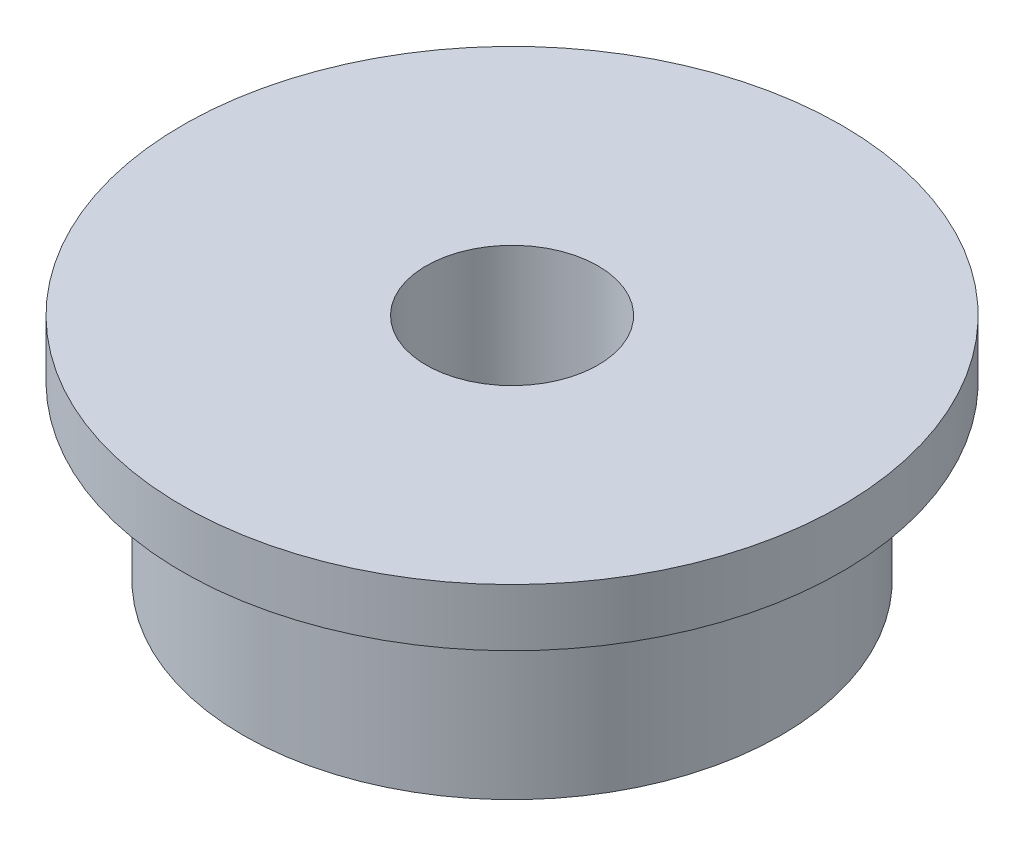
ISO-10303-21;
HEADER;
FILE_DESCRIPTION(('STEP AP214'),'2;1');
FILE_NAME('part.step','',(''),(''),'','','');
FILE_SCHEMA(('AUTOMOTIVE_DESIGN { 1 0 10303 214 1 1 1 1 }'));
ENDSEC;
DATA;
#1=APPLICATION_CONTEXT('core data for automotive mechanical design processes');
#2=APPLICATION_PROTOCOL_DEFINITION('international standard','automotive_design',2000,#1);
#3=PRODUCT_CONTEXT('',#1,'mechanical');
#4=PRODUCT('Part','Part','',(#3));
#5=PRODUCT_RELATED_PRODUCT_CATEGORY('part','',(#4));
#6=PRODUCT_DEFINITION_FORMATION('','',#4);
#7=PRODUCT_DEFINITION_CONTEXT('part definition',#1,'design');
#8=PRODUCT_DEFINITION('design','',#6,#7);
#9=PRODUCT_DEFINITION_SHAPE('','',#8);
#10=(LENGTH_UNIT() NAMED_UNIT(*) SI_UNIT(.MILLI.,.METRE.));
#11=(NAMED_UNIT(*) PLANE_ANGLE_UNIT() SI_UNIT($,.RADIAN.));
#12=(NAMED_UNIT(*) SI_UNIT($,.STERADIAN.) SOLID_ANGLE_UNIT());
#13=UNCERTAINTY_MEASURE_WITH_UNIT(LENGTH_MEASURE(1.E-05),#10,'distance_accuracy_value','');
#14=(GEOMETRIC_REPRESENTATION_CONTEXT(3) GLOBAL_UNCERTAINTY_ASSIGNED_CONTEXT((#13)) GLOBAL_UNIT_ASSIGNED_CONTEXT((#10,
#11,#12)) REPRESENTATION_CONTEXT('',''));
#15=CARTESIAN_POINT('',(0.,0.,0.));
#16=DIRECTION('',(0.,0.,1.));
#17=DIRECTION('',(1.,0.,0.));
#18=AXIS2_PLACEMENT_3D('',#15,#16,#17);
#19=CARTESIAN_POINT('',(-4.69,0.543442622950821,0.));
#20=DIRECTION('',(0.,1.,0.));
#21=DIRECTION('',(0.,0.,1.));
#22=AXIS2_PLACEMENT_3D('',#19,#20,#21);
#23=PLANE('',#22);
#24=CARTESIAN_POINT('',(0.,0.543442622950821,0.));
#25=DIRECTION('',(0.,-1.,0.));
#26=DIRECTION('',(0.,0.,-1.));
#27=AXIS2_PLACEMENT_3D('',#24,#25,#26);
#28=CIRCLE('',#27,1.5);
#29=CARTESIAN_POINT('',(0.,0.543442622950821,-1.5));
#30=VERTEX_POINT('',#29);
#31=EDGE_CURVE('E10',#30,#30,#28,.T.);
#32=ORIENTED_EDGE('',*,*,#31,.F.);
#33=EDGE_LOOP('',(#32));
#34=FACE_BOUND('',#33,.T.);
#35=CARTESIAN_POINT('',(0.,0.543442622950821,0.));
#36=DIRECTION('',(0.,-1.,0.));
#37=DIRECTION('',(0.,0.,-1.));
#38=AXIS2_PLACEMENT_3D('',#35,#36,#37);
#39=CIRCLE('',#38,4.69);
#40=CARTESIAN_POINT('',(0.,0.543442622950821,-4.69));
#41=VERTEX_POINT('',#40);
#42=EDGE_CURVE('E54',#41,#41,#39,.T.);
#43=ORIENTED_EDGE('',*,*,#42,.T.);
#44=EDGE_LOOP('',(#43));
#45=FACE_BOUND('',#44,.T.);
#46=ADVANCED_FACE('F32',(#34,#45),#23,.F.);
#47=CARTESIAN_POINT('',(0.,0.,0.));
#48=DIRECTION('',(0.,-1.,0.));
#49=DIRECTION('',(0.,0.,-1.));
#50=AXIS2_PLACEMENT_3D('',#47,#48,#49);
#51=CYLINDRICAL_SURFACE('',#50,1.5);
#52=CARTESIAN_POINT('',(0.,4.54344262295082,0.));
#53=DIRECTION('',(0.,-1.,0.));
#54=DIRECTION('',(0.,0.,-1.));
#55=AXIS2_PLACEMENT_3D('',#52,#53,#54);
#56=CIRCLE('',#55,1.5);
#57=CARTESIAN_POINT('',(0.,4.54344262295082,-1.5));
#58=VERTEX_POINT('',#57);
#59=EDGE_CURVE('E38',#58,#58,#56,.T.);
#60=ORIENTED_EDGE('',*,*,#59,.F.);
#61=EDGE_LOOP('',(#60));
#62=FACE_BOUND('',#61,.T.);
#63=ORIENTED_EDGE('',*,*,#31,.T.);
#64=EDGE_LOOP('',(#63));
#65=FACE_BOUND('',#64,.T.);
#66=ADVANCED_FACE('F79',(#62,#65),#51,.F.);
#67=CARTESIAN_POINT('',(-1.5,4.54344262295082,0.));
#68=DIRECTION('',(0.,-1.,0.));
#69=DIRECTION('',(0.,0.,-1.));
#70=AXIS2_PLACEMENT_3D('',#67,#68,#69);
#71=PLANE('',#70);
#72=CARTESIAN_POINT('',(0.,4.54344262295082,0.));
#73=DIRECTION('',(0.,-1.,0.));
#74=DIRECTION('',(0.,0.,-1.));
#75=AXIS2_PLACEMENT_3D('',#72,#73,#74);
#76=CIRCLE('',#75,5.75);
#77=CARTESIAN_POINT('',(0.,4.54344262295082,-5.75));
#78=VERTEX_POINT('',#77);
#79=EDGE_CURVE('E42',#78,#78,#76,.T.);
#80=ORIENTED_EDGE('',*,*,#79,.F.);
#81=EDGE_LOOP('',(#80));
#82=FACE_BOUND('',#81,.T.);
#83=ORIENTED_EDGE('',*,*,#59,.T.);
#84=EDGE_LOOP('',(#83));
#85=FACE_BOUND('',#84,.T.);
#86=ADVANCED_FACE('F74',(#82,#85),#71,.F.);
#87=CARTESIAN_POINT('',(0.,0.,0.));
#88=DIRECTION('',(0.,-1.,0.));
#89=DIRECTION('',(0.,0.,-1.));
#90=AXIS2_PLACEMENT_3D('',#87,#88,#89);
#91=CYLINDRICAL_SURFACE('',#90,5.75);
#92=CARTESIAN_POINT('',(0.,3.54344262295082,0.));
#93=DIRECTION('',(0.,-1.,0.));
#94=DIRECTION('',(0.,0.,-1.));
#95=AXIS2_PLACEMENT_3D('',#92,#93,#94);
#96=CIRCLE('',#95,5.75);
#97=CARTESIAN_POINT('',(0.,3.54344262295082,-5.75));
#98=VERTEX_POINT('',#97);
#99=EDGE_CURVE('E46',#98,#98,#96,.T.);
#100=ORIENTED_EDGE('',*,*,#99,.F.);
#101=EDGE_LOOP('',(#100));
#102=FACE_BOUND('',#101,.T.);
#103=ORIENTED_EDGE('',*,*,#79,.T.);
#104=EDGE_LOOP('',(#103));
#105=FACE_BOUND('',#104,.T.);
#106=ADVANCED_FACE('F68',(#102,#105),#91,.T.);
#107=CARTESIAN_POINT('',(-5.75,3.54344262295082,0.));
#108=DIRECTION('',(0.,1.,0.));
#109=DIRECTION('',(0.,0.,1.));
#110=AXIS2_PLACEMENT_3D('',#107,#108,#109);
#111=PLANE('',#110);
#112=CARTESIAN_POINT('',(0.,3.54344262295082,0.));
#113=DIRECTION('',(0.,-1.,0.));
#114=DIRECTION('',(0.,0.,-1.));
#115=AXIS2_PLACEMENT_3D('',#112,#113,#114);
#116=CIRCLE('',#115,4.69);
#117=CARTESIAN_POINT('',(0.,3.54344262295082,-4.69));
#118=VERTEX_POINT('',#117);
#119=EDGE_CURVE('E51',#118,#118,#116,.T.);
#120=ORIENTED_EDGE('',*,*,#119,.F.);
#121=EDGE_LOOP('',(#120));
#122=FACE_BOUND('',#121,.T.);
#123=ORIENTED_EDGE('',*,*,#99,.T.);
#124=EDGE_LOOP('',(#123));
#125=FACE_BOUND('',#124,.T.);
#126=ADVANCED_FACE('F62',(#122,#125),#111,.F.);
#127=CARTESIAN_POINT('',(0.,0.,0.));
#128=DIRECTION('',(0.,-1.,0.));
#129=DIRECTION('',(0.,0.,-1.));
#130=AXIS2_PLACEMENT_3D('',#127,#128,#129);
#131=CYLINDRICAL_SURFACE('',#130,4.69);
#132=ORIENTED_EDGE('',*,*,#42,.F.);
#133=EDGE_LOOP('',(#132));
#134=FACE_BOUND('',#133,.T.);
#135=ORIENTED_EDGE('',*,*,#119,.T.);
#136=EDGE_LOOP('',(#135));
#137=FACE_BOUND('',#136,.T.);
#138=ADVANCED_FACE('F59',(#134,#137),#131,.T.);
#139=CLOSED_SHELL('',(#46,#66,#86,#106,#126,#138));
#140=MANIFOLD_SOLID_BREP('B2',#139);
#141=ADVANCED_BREP_SHAPE_REPRESENTATION('',(#18,#140),#14);
#142=SHAPE_DEFINITION_REPRESENTATION(#9,#141);
ENDSEC;
END-ISO-10303-21;
